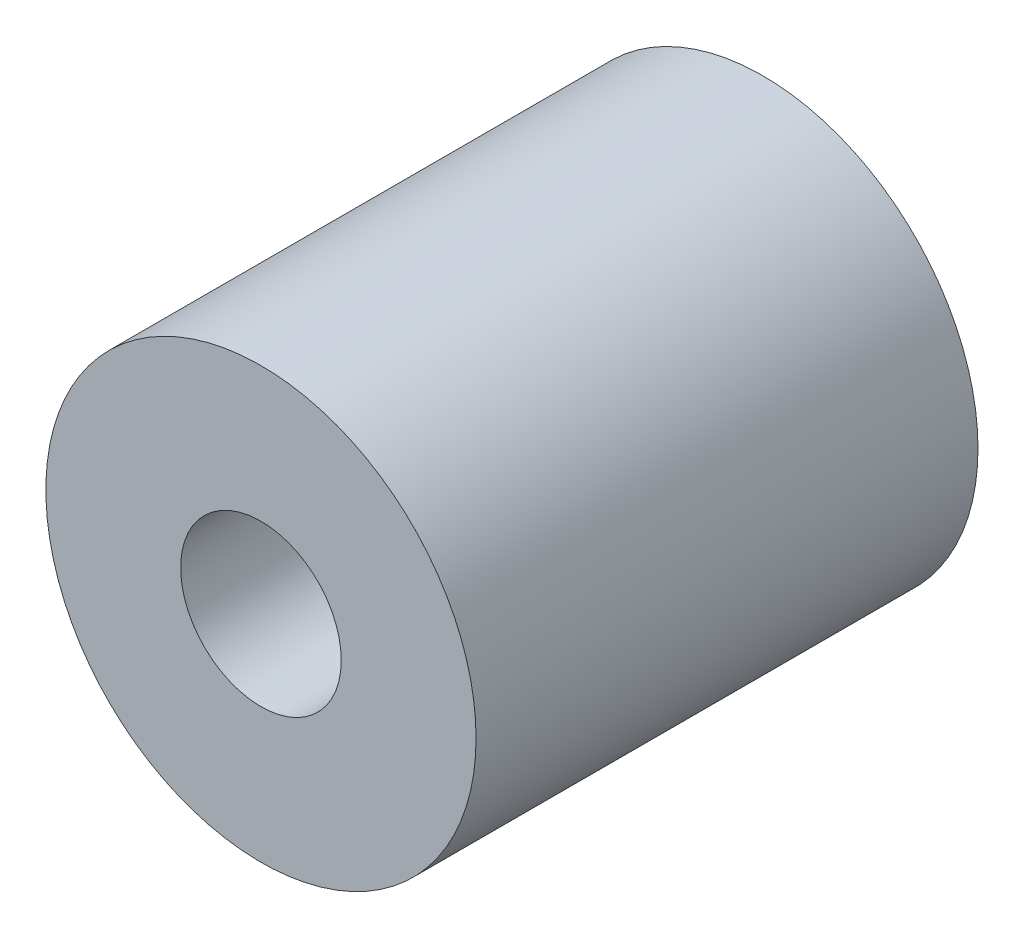
ISO-10303-21;
HEADER;
FILE_DESCRIPTION(('STEP AP214'),'2;1');
FILE_NAME('part.step','',(''),(''),'','','');
FILE_SCHEMA(('AUTOMOTIVE_DESIGN { 1 0 10303 214 1 1 1 1 }'));
ENDSEC;
DATA;
#1=APPLICATION_CONTEXT('core data for automotive mechanical design processes');
#2=APPLICATION_PROTOCOL_DEFINITION('international standard','automotive_design',2000,#1);
#3=PRODUCT_CONTEXT('',#1,'mechanical');
#4=PRODUCT('Part','Part','',(#3));
#5=PRODUCT_RELATED_PRODUCT_CATEGORY('part','',(#4));
#6=PRODUCT_DEFINITION_FORMATION('','',#4);
#7=PRODUCT_DEFINITION_CONTEXT('part definition',#1,'design');
#8=PRODUCT_DEFINITION('design','',#6,#7);
#9=PRODUCT_DEFINITION_SHAPE('','',#8);
#10=(LENGTH_UNIT() NAMED_UNIT(*) SI_UNIT(.MILLI.,.METRE.));
#11=(NAMED_UNIT(*) PLANE_ANGLE_UNIT() SI_UNIT($,.RADIAN.));
#12=(NAMED_UNIT(*) SI_UNIT($,.STERADIAN.) SOLID_ANGLE_UNIT());
#13=UNCERTAINTY_MEASURE_WITH_UNIT(LENGTH_MEASURE(1.E-05),#10,'distance_accuracy_value','');
#14=(GEOMETRIC_REPRESENTATION_CONTEXT(3) GLOBAL_UNCERTAINTY_ASSIGNED_CONTEXT((#13)) GLOBAL_UNIT_ASSIGNED_CONTEXT((#10,
#11,#12)) REPRESENTATION_CONTEXT('',''));
#15=CARTESIAN_POINT('',(0.,0.,0.));
#16=DIRECTION('',(0.,0.,1.));
#17=DIRECTION('',(1.,0.,0.));
#18=AXIS2_PLACEMENT_3D('',#15,#16,#17);
#19=CARTESIAN_POINT('',(0.,0.,5.55625));
#20=DIRECTION('',(0.,0.,1.));
#21=DIRECTION('',(1.,0.,0.));
#22=AXIS2_PLACEMENT_3D('',#19,#20,#21);
#23=PLANE('',#22);
#24=CARTESIAN_POINT('',(0.,0.,5.55625));
#25=DIRECTION('',(0.,0.,1.));
#26=DIRECTION('',(1.,0.,0.));
#27=AXIS2_PLACEMENT_3D('',#24,#25,#26);
#28=CIRCLE('',#27,4.7625);
#29=CARTESIAN_POINT('',(4.7625,0.,5.55625));
#30=VERTEX_POINT('',#29);
#31=EDGE_CURVE('E10',#30,#30,#28,.T.);
#32=ORIENTED_EDGE('',*,*,#31,.T.);
#33=EDGE_LOOP('',(#32));
#34=FACE_BOUND('',#33,.T.);
#35=CARTESIAN_POINT('',(0.,0.,5.55625));
#36=DIRECTION('',(0.,0.,1.));
#37=DIRECTION('',(1.,0.,0.));
#38=AXIS2_PLACEMENT_3D('',#35,#36,#37);
#39=CIRCLE('',#38,1.778);
#40=CARTESIAN_POINT('',(1.778,0.,5.55625));
#41=VERTEX_POINT('',#40);
#42=EDGE_CURVE('E41',#41,#41,#39,.T.);
#43=ORIENTED_EDGE('',*,*,#42,.F.);
#44=EDGE_LOOP('',(#43));
#45=FACE_BOUND('',#44,.T.);
#46=ADVANCED_FACE('F30',(#34,#45),#23,.T.);
#47=CARTESIAN_POINT('',(0.,0.,-5.55625));
#48=DIRECTION('',(0.,0.,1.));
#49=DIRECTION('',(1.,0.,0.));
#50=AXIS2_PLACEMENT_3D('',#47,#48,#49);
#51=PLANE('',#50);
#52=CARTESIAN_POINT('',(0.,0.,-5.55625));
#53=DIRECTION('',(0.,0.,1.));
#54=DIRECTION('',(1.,0.,0.));
#55=AXIS2_PLACEMENT_3D('',#52,#53,#54);
#56=CIRCLE('',#55,4.7625);
#57=CARTESIAN_POINT('',(4.7625,0.,-5.55625));
#58=VERTEX_POINT('',#57);
#59=EDGE_CURVE('E34',#58,#58,#56,.T.);
#60=ORIENTED_EDGE('',*,*,#59,.F.);
#61=EDGE_LOOP('',(#60));
#62=FACE_BOUND('',#61,.T.);
#63=CARTESIAN_POINT('',(0.,0.,-5.55625));
#64=DIRECTION('',(0.,0.,1.));
#65=DIRECTION('',(1.,0.,0.));
#66=AXIS2_PLACEMENT_3D('',#63,#64,#65);
#67=CIRCLE('',#66,1.778);
#68=CARTESIAN_POINT('',(1.778,0.,-5.55625));
#69=VERTEX_POINT('',#68);
#70=EDGE_CURVE('E43',#69,#69,#67,.T.);
#71=ORIENTED_EDGE('',*,*,#70,.T.);
#72=EDGE_LOOP('',(#71));
#73=FACE_BOUND('',#72,.T.);
#74=ADVANCED_FACE('F53',(#62,#73),#51,.F.);
#75=CARTESIAN_POINT('',(0.,0.,5.55625));
#76=DIRECTION('',(0.,0.,-1.));
#77=DIRECTION('',(-1.,0.,0.));
#78=AXIS2_PLACEMENT_3D('',#75,#76,#77);
#79=CYLINDRICAL_SURFACE('',#78,4.7625);
#80=ORIENTED_EDGE('',*,*,#31,.F.);
#81=EDGE_LOOP('',(#80));
#82=FACE_BOUND('',#81,.T.);
#83=ORIENTED_EDGE('',*,*,#59,.T.);
#84=EDGE_LOOP('',(#83));
#85=FACE_BOUND('',#84,.T.);
#86=ADVANCED_FACE('F32',(#82,#85),#79,.T.);
#87=CARTESIAN_POINT('',(0.,0.,5.55625));
#88=DIRECTION('',(0.,0.,-1.));
#89=DIRECTION('',(-1.,0.,0.));
#90=AXIS2_PLACEMENT_3D('',#87,#88,#89);
#91=CYLINDRICAL_SURFACE('',#90,1.778);
#92=ORIENTED_EDGE('',*,*,#42,.T.);
#93=EDGE_LOOP('',(#92));
#94=FACE_BOUND('',#93,.T.);
#95=ORIENTED_EDGE('',*,*,#70,.F.);
#96=EDGE_LOOP('',(#95));
#97=FACE_BOUND('',#96,.T.);
#98=ADVANCED_FACE('F49',(#94,#97),#91,.F.);
#99=CLOSED_SHELL('',(#46,#74,#86,#98));
#100=MANIFOLD_SOLID_BREP('B2',#99);
#101=ADVANCED_BREP_SHAPE_REPRESENTATION('',(#18,#100),#14);
#102=SHAPE_DEFINITION_REPRESENTATION(#9,#101);
ENDSEC;
END-ISO-10303-21;
